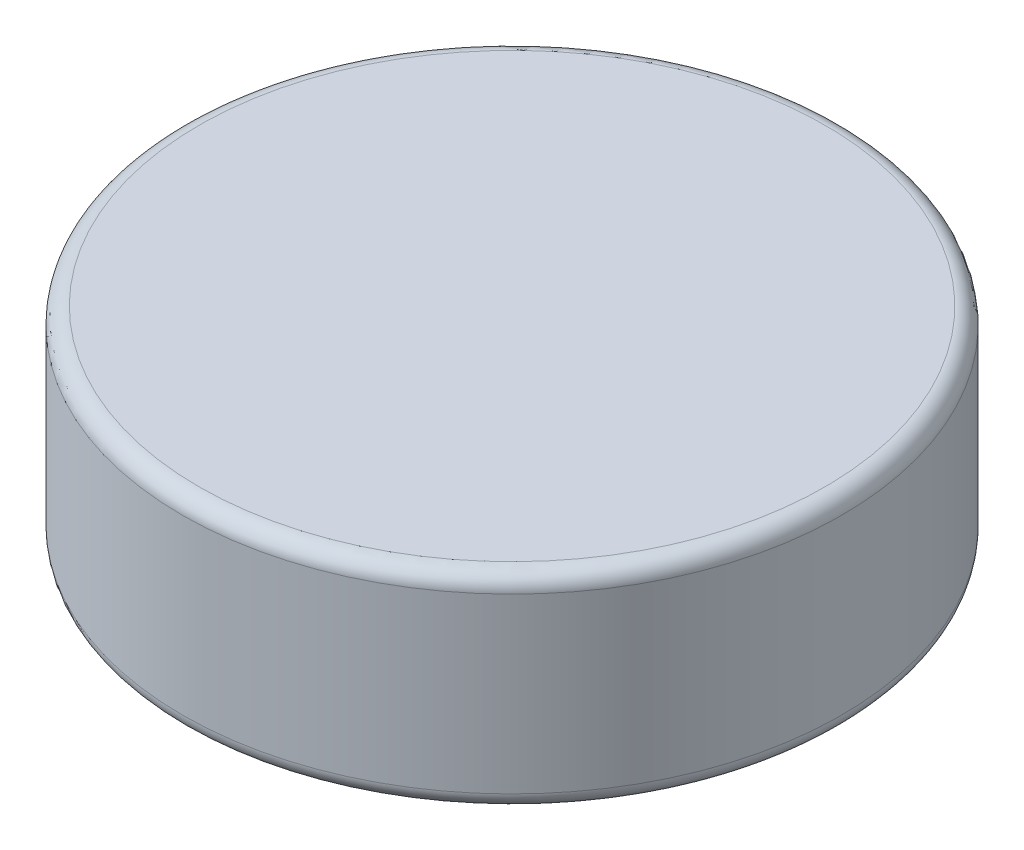
ISO-10303-21;
HEADER;
FILE_DESCRIPTION(('STEP AP214'),'2;1');
FILE_NAME('part.step','',(''),(''),'','','');
FILE_SCHEMA(('AUTOMOTIVE_DESIGN { 1 0 10303 214 1 1 1 1 }'));
ENDSEC;
DATA;
#1=APPLICATION_CONTEXT('core data for automotive mechanical design processes');
#2=APPLICATION_PROTOCOL_DEFINITION('international standard','automotive_design',2000,#1);
#3=PRODUCT_CONTEXT('',#1,'mechanical');
#4=PRODUCT('Part','Part','',(#3));
#5=PRODUCT_RELATED_PRODUCT_CATEGORY('part','',(#4));
#6=PRODUCT_DEFINITION_FORMATION('','',#4);
#7=PRODUCT_DEFINITION_CONTEXT('part definition',#1,'design');
#8=PRODUCT_DEFINITION('design','',#6,#7);
#9=PRODUCT_DEFINITION_SHAPE('','',#8);
#10=(LENGTH_UNIT() NAMED_UNIT(*) SI_UNIT(.MILLI.,.METRE.));
#11=(NAMED_UNIT(*) PLANE_ANGLE_UNIT() SI_UNIT($,.RADIAN.));
#12=(NAMED_UNIT(*) SI_UNIT($,.STERADIAN.) SOLID_ANGLE_UNIT());
#13=UNCERTAINTY_MEASURE_WITH_UNIT(LENGTH_MEASURE(1.E-05),#10,'distance_accuracy_value','');
#14=(GEOMETRIC_REPRESENTATION_CONTEXT(3) GLOBAL_UNCERTAINTY_ASSIGNED_CONTEXT((#13)) GLOBAL_UNIT_ASSIGNED_CONTEXT((#10,
#11,#12)) REPRESENTATION_CONTEXT('',''));
#15=CARTESIAN_POINT('',(0.,0.,0.));
#16=DIRECTION('',(0.,0.,1.));
#17=DIRECTION('',(1.,0.,0.));
#18=AXIS2_PLACEMENT_3D('',#15,#16,#17);
#19=CARTESIAN_POINT('',(0.,2.5,0.));
#20=DIRECTION('',(0.,-1.,0.));
#21=DIRECTION('',(0.,0.,-1.));
#22=AXIS2_PLACEMENT_3D('',#19,#20,#21);
#23=CYLINDRICAL_SURFACE('',#22,4.);
#24=CARTESIAN_POINT('',(0.,0.2,0.));
#25=DIRECTION('',(0.,1.,0.));
#26=DIRECTION('',(0.,0.,1.));
#27=AXIS2_PLACEMENT_3D('',#24,#25,#26);
#28=CIRCLE('',#27,4.);
#29=CARTESIAN_POINT('',(0.,0.2,4.));
#30=VERTEX_POINT('',#29);
#31=EDGE_CURVE('E50',#30,#30,#28,.T.);
#32=ORIENTED_EDGE('',*,*,#31,.T.);
#33=EDGE_LOOP('',(#32));
#34=FACE_BOUND('',#33,.T.);
#35=CARTESIAN_POINT('',(0.,2.3,0.));
#36=DIRECTION('',(0.,1.,0.));
#37=DIRECTION('',(0.,0.,1.));
#38=AXIS2_PLACEMENT_3D('',#35,#36,#37);
#39=CIRCLE('',#38,4.);
#40=CARTESIAN_POINT('',(0.,2.3,4.));
#41=VERTEX_POINT('',#40);
#42=EDGE_CURVE('E55',#41,#41,#39,.F.);
#43=ORIENTED_EDGE('',*,*,#42,.T.);
#44=EDGE_LOOP('',(#43));
#45=FACE_BOUND('',#44,.T.);
#46=ADVANCED_FACE('F37',(#34,#45),#23,.T.);
#47=CARTESIAN_POINT('',(0.,2.5,0.));
#48=DIRECTION('',(0.,1.,0.));
#49=DIRECTION('',(0.,0.,1.));
#50=AXIS2_PLACEMENT_3D('',#47,#48,#49);
#51=PLANE('',#50);
#52=CARTESIAN_POINT('',(0.,2.5,0.));
#53=DIRECTION('',(0.,1.,0.));
#54=DIRECTION('',(0.,0.,1.));
#55=AXIS2_PLACEMENT_3D('',#52,#53,#54);
#56=CIRCLE('',#55,3.8);
#57=CARTESIAN_POINT('',(0.,2.5,3.8));
#58=VERTEX_POINT('',#57);
#59=EDGE_CURVE('E10',#58,#58,#56,.T.);
#60=ORIENTED_EDGE('',*,*,#59,.T.);
#61=EDGE_LOOP('',(#60));
#62=FACE_BOUND('',#61,.T.);
#63=ADVANCED_FACE('F72',(#62),#51,.T.);
#64=CARTESIAN_POINT('',(0.,0.,0.));
#65=DIRECTION('',(0.,1.,0.));
#66=DIRECTION('',(0.,0.,1.));
#67=AXIS2_PLACEMENT_3D('',#64,#65,#66);
#68=PLANE('',#67);
#69=CARTESIAN_POINT('',(0.,0.,0.));
#70=DIRECTION('',(0.,1.,0.));
#71=DIRECTION('',(0.,0.,1.));
#72=AXIS2_PLACEMENT_3D('',#69,#70,#71);
#73=CIRCLE('',#72,3.8);
#74=CARTESIAN_POINT('',(0.,0.,3.8));
#75=VERTEX_POINT('',#74);
#76=EDGE_CURVE('E45',#75,#75,#73,.F.);
#77=ORIENTED_EDGE('',*,*,#76,.T.);
#78=EDGE_LOOP('',(#77));
#79=FACE_BOUND('',#78,.T.);
#80=ADVANCED_FACE('F69',(#79),#68,.F.);
#81=CARTESIAN_POINT('',(0.,0.2,0.));
#82=DIRECTION('',(0.,1.,0.));
#83=DIRECTION('',(0.,0.,1.));
#84=AXIS2_PLACEMENT_3D('',#81,#82,#83);
#85=TOROIDAL_SURFACE('',#84,3.8,0.2);
#86=ORIENTED_EDGE('',*,*,#76,.F.);
#87=EDGE_LOOP('',(#86));
#88=FACE_BOUND('',#87,.T.);
#89=ORIENTED_EDGE('',*,*,#31,.F.);
#90=EDGE_LOOP('',(#89));
#91=FACE_BOUND('',#90,.T.);
#92=ADVANCED_FACE('F65',(#88,#91),#85,.T.);
#93=CARTESIAN_POINT('',(0.,2.3,0.));
#94=DIRECTION('',(0.,1.,0.));
#95=DIRECTION('',(0.,0.,1.));
#96=AXIS2_PLACEMENT_3D('',#93,#94,#95);
#97=TOROIDAL_SURFACE('',#96,3.8,0.2);
#98=ORIENTED_EDGE('',*,*,#42,.F.);
#99=EDGE_LOOP('',(#98));
#100=FACE_BOUND('',#99,.T.);
#101=ORIENTED_EDGE('',*,*,#59,.F.);
#102=EDGE_LOOP('',(#101));
#103=FACE_BOUND('',#102,.T.);
#104=ADVANCED_FACE('F39',(#100,#103),#97,.T.);
#105=CLOSED_SHELL('',(#46,#63,#80,#92,#104));
#106=MANIFOLD_SOLID_BREP('B2',#105);
#107=ADVANCED_BREP_SHAPE_REPRESENTATION('',(#18,#106),#14);
#108=SHAPE_DEFINITION_REPRESENTATION(#9,#107);
ENDSEC;
END-ISO-10303-21;
